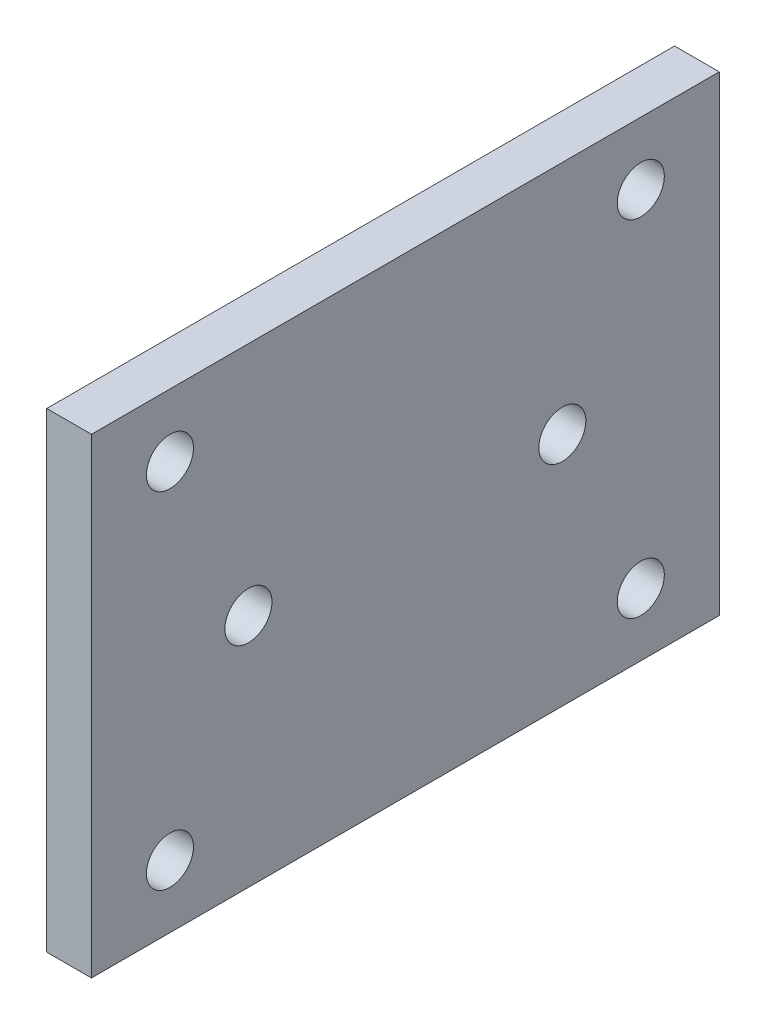
ISO-10303-21;
HEADER;
FILE_DESCRIPTION(('STEP AP214'),'2;1');
FILE_NAME('part.step','',(''),(''),'','','');
FILE_SCHEMA(('AUTOMOTIVE_DESIGN { 1 0 10303 214 1 1 1 1 }'));
ENDSEC;
DATA;
#1=APPLICATION_CONTEXT('core data for automotive mechanical design processes');
#2=APPLICATION_PROTOCOL_DEFINITION('international standard','automotive_design',2000,#1);
#3=PRODUCT_CONTEXT('',#1,'mechanical');
#4=PRODUCT('Part','Part','',(#3));
#5=PRODUCT_RELATED_PRODUCT_CATEGORY('part','',(#4));
#6=PRODUCT_DEFINITION_FORMATION('','',#4);
#7=PRODUCT_DEFINITION_CONTEXT('part definition',#1,'design');
#8=PRODUCT_DEFINITION('design','',#6,#7);
#9=PRODUCT_DEFINITION_SHAPE('','',#8);
#10=(LENGTH_UNIT() NAMED_UNIT(*) SI_UNIT(.MILLI.,.METRE.));
#11=(NAMED_UNIT(*) PLANE_ANGLE_UNIT() SI_UNIT($,.RADIAN.));
#12=(NAMED_UNIT(*) SI_UNIT($,.STERADIAN.) SOLID_ANGLE_UNIT());
#13=UNCERTAINTY_MEASURE_WITH_UNIT(LENGTH_MEASURE(1.E-05),#10,'distance_accuracy_value','');
#14=(GEOMETRIC_REPRESENTATION_CONTEXT(3) GLOBAL_UNCERTAINTY_ASSIGNED_CONTEXT((#13)) GLOBAL_UNIT_ASSIGNED_CONTEXT((#10,
#11,#12)) REPRESENTATION_CONTEXT('',''));
#15=CARTESIAN_POINT('',(0.,0.,0.));
#16=DIRECTION('',(0.,0.,1.));
#17=DIRECTION('',(1.,0.,0.));
#18=AXIS2_PLACEMENT_3D('',#15,#16,#17);
#19=CARTESIAN_POINT('',(2.85,0.,0.));
#20=DIRECTION('',(1.,0.,0.));
#21=DIRECTION('',(0.,0.,-1.));
#22=AXIS2_PLACEMENT_3D('',#19,#20,#21);
#23=PLANE('',#22);
#24=CARTESIAN_POINT('',(2.85,-11.,15.));
#25=DIRECTION('',(-1.,0.,0.));
#26=DIRECTION('',(0.,0.,-1.));
#27=AXIS2_PLACEMENT_3D('',#24,#25,#26);
#28=CIRCLE('',#27,1.5);
#29=CARTESIAN_POINT('',(2.85,-11.,13.5));
#30=VERTEX_POINT('',#29);
#31=EDGE_CURVE('E136',#30,#30,#28,.T.);
#32=ORIENTED_EDGE('',*,*,#31,.T.);
#33=EDGE_LOOP('',(#32));
#34=FACE_BOUND('',#33,.T.);
#35=CARTESIAN_POINT('',(2.85,11.,-15.));
#36=DIRECTION('',(1.,0.,0.));
#37=DIRECTION('',(0.,0.,-1.));
#38=AXIS2_PLACEMENT_3D('',#35,#36,#37);
#39=CIRCLE('',#38,1.5);
#40=CARTESIAN_POINT('',(2.85,11.,-16.5));
#41=VERTEX_POINT('',#40);
#42=EDGE_CURVE('E130',#41,#41,#39,.T.);
#43=ORIENTED_EDGE('',*,*,#42,.F.);
#44=EDGE_LOOP('',(#43));
#45=FACE_BOUND('',#44,.T.);
#46=CARTESIAN_POINT('',(2.85,11.,15.));
#47=DIRECTION('',(1.,0.,0.));
#48=DIRECTION('',(0.,0.,-1.));
#49=AXIS2_PLACEMENT_3D('',#46,#47,#48);
#50=CIRCLE('',#49,1.5);
#51=CARTESIAN_POINT('',(2.85,11.,13.5));
#52=VERTEX_POINT('',#51);
#53=EDGE_CURVE('E124',#52,#52,#50,.T.);
#54=ORIENTED_EDGE('',*,*,#53,.F.);
#55=EDGE_LOOP('',(#54));
#56=FACE_BOUND('',#55,.T.);
#57=CARTESIAN_POINT('',(2.85,0.,-10.));
#58=DIRECTION('',(1.,0.,0.));
#59=DIRECTION('',(0.,0.,-1.));
#60=AXIS2_PLACEMENT_3D('',#57,#58,#59);
#61=CIRCLE('',#60,1.5);
#62=CARTESIAN_POINT('',(2.85,0.,-11.5));
#63=VERTEX_POINT('',#62);
#64=EDGE_CURVE('E118',#63,#63,#61,.T.);
#65=ORIENTED_EDGE('',*,*,#64,.F.);
#66=EDGE_LOOP('',(#65));
#67=FACE_BOUND('',#66,.T.);
#68=CARTESIAN_POINT('',(2.85,0.,10.));
#69=DIRECTION('',(1.,0.,0.));
#70=DIRECTION('',(0.,0.,-1.));
#71=AXIS2_PLACEMENT_3D('',#68,#69,#70);
#72=CIRCLE('',#71,1.5);
#73=CARTESIAN_POINT('',(2.85,0.,8.5));
#74=VERTEX_POINT('',#73);
#75=EDGE_CURVE('E112',#74,#74,#72,.T.);
#76=ORIENTED_EDGE('',*,*,#75,.F.);
#77=EDGE_LOOP('',(#76));
#78=FACE_BOUND('',#77,.T.);
#79=DIRECTION('',(0.,1.,0.));
#80=VECTOR('',#79,1.);
#81=CARTESIAN_POINT('',(2.85,15.,-20.));
#82=LINE('',#81,#80);
#83=CARTESIAN_POINT('',(2.85,-15.,-20.));
#84=VERTEX_POINT('',#83);
#85=CARTESIAN_POINT('',(2.85,15.,-20.));
#86=VERTEX_POINT('',#85);
#87=EDGE_CURVE('E85',#84,#86,#82,.T.);
#88=ORIENTED_EDGE('',*,*,#87,.T.);
#89=DIRECTION('',(0.,0.,1.));
#90=VECTOR('',#89,1.);
#91=CARTESIAN_POINT('',(2.85,15.,20.));
#92=LINE('',#91,#90);
#93=CARTESIAN_POINT('',(2.85,15.,20.));
#94=VERTEX_POINT('',#93);
#95=EDGE_CURVE('E80',#86,#94,#92,.T.);
#96=ORIENTED_EDGE('',*,*,#95,.T.);
#97=DIRECTION('',(0.,-1.,0.));
#98=VECTOR('',#97,1.);
#99=CARTESIAN_POINT('',(2.85,15.,20.));
#100=LINE('',#99,#98);
#101=CARTESIAN_POINT('',(2.85,-15.,20.));
#102=VERTEX_POINT('',#101);
#103=EDGE_CURVE('E83',#94,#102,#100,.T.);
#104=ORIENTED_EDGE('',*,*,#103,.T.);
#105=DIRECTION('',(0.,0.,-1.));
#106=VECTOR('',#105,1.);
#107=CARTESIAN_POINT('',(2.85,-15.,20.));
#108=LINE('',#107,#106);
#109=EDGE_CURVE('E50',#102,#84,#108,.T.);
#110=ORIENTED_EDGE('',*,*,#109,.T.);
#111=EDGE_LOOP('',(#88,#96,#104,#110));
#112=FACE_BOUND('',#111,.T.);
#113=CARTESIAN_POINT('',(2.85,-11.,-15.));
#114=DIRECTION('',(-1.,0.,0.));
#115=DIRECTION('',(0.,0.,-1.));
#116=AXIS2_PLACEMENT_3D('',#113,#114,#115);
#117=CIRCLE('',#116,1.5);
#118=CARTESIAN_POINT('',(2.85,-11.,-16.5));
#119=VERTEX_POINT('',#118);
#120=EDGE_CURVE('E142',#119,#119,#117,.T.);
#121=ORIENTED_EDGE('',*,*,#120,.T.);
#122=EDGE_LOOP('',(#121));
#123=FACE_BOUND('',#122,.T.);
#124=ADVANCED_FACE('F33',(#34,#45,#56,#67,#78,#112,#123),#23,.T.);
#125=CARTESIAN_POINT('',(0.,0.,0.));
#126=DIRECTION('',(1.,0.,0.));
#127=DIRECTION('',(0.,0.,-1.));
#128=AXIS2_PLACEMENT_3D('',#125,#126,#127);
#129=PLANE('',#128);
#130=CARTESIAN_POINT('',(0.,-11.,15.));
#131=DIRECTION('',(-1.,0.,0.));
#132=DIRECTION('',(0.,0.,-1.));
#133=AXIS2_PLACEMENT_3D('',#130,#131,#132);
#134=CIRCLE('',#133,1.5);
#135=CARTESIAN_POINT('',(0.,-11.,13.5));
#136=VERTEX_POINT('',#135);
#137=EDGE_CURVE('E133',#136,#136,#134,.T.);
#138=ORIENTED_EDGE('',*,*,#137,.F.);
#139=EDGE_LOOP('',(#138));
#140=FACE_BOUND('',#139,.T.);
#141=CARTESIAN_POINT('',(0.,11.,-15.));
#142=DIRECTION('',(1.,0.,0.));
#143=DIRECTION('',(0.,0.,-1.));
#144=AXIS2_PLACEMENT_3D('',#141,#142,#143);
#145=CIRCLE('',#144,1.5);
#146=CARTESIAN_POINT('',(0.,11.,-16.5));
#147=VERTEX_POINT('',#146);
#148=EDGE_CURVE('E127',#147,#147,#145,.T.);
#149=ORIENTED_EDGE('',*,*,#148,.T.);
#150=EDGE_LOOP('',(#149));
#151=FACE_BOUND('',#150,.T.);
#152=CARTESIAN_POINT('',(0.,11.,15.));
#153=DIRECTION('',(1.,0.,0.));
#154=DIRECTION('',(0.,0.,-1.));
#155=AXIS2_PLACEMENT_3D('',#152,#153,#154);
#156=CIRCLE('',#155,1.5);
#157=CARTESIAN_POINT('',(0.,11.,13.5));
#158=VERTEX_POINT('',#157);
#159=EDGE_CURVE('E121',#158,#158,#156,.T.);
#160=ORIENTED_EDGE('',*,*,#159,.T.);
#161=EDGE_LOOP('',(#160));
#162=FACE_BOUND('',#161,.T.);
#163=CARTESIAN_POINT('',(0.,0.,-10.));
#164=DIRECTION('',(1.,0.,0.));
#165=DIRECTION('',(0.,0.,-1.));
#166=AXIS2_PLACEMENT_3D('',#163,#164,#165);
#167=CIRCLE('',#166,1.5);
#168=CARTESIAN_POINT('',(0.,0.,-11.5));
#169=VERTEX_POINT('',#168);
#170=EDGE_CURVE('E115',#169,#169,#167,.T.);
#171=ORIENTED_EDGE('',*,*,#170,.T.);
#172=EDGE_LOOP('',(#171));
#173=FACE_BOUND('',#172,.T.);
#174=CARTESIAN_POINT('',(0.,0.,10.));
#175=DIRECTION('',(1.,0.,0.));
#176=DIRECTION('',(0.,0.,-1.));
#177=AXIS2_PLACEMENT_3D('',#174,#175,#176);
#178=CIRCLE('',#177,1.5);
#179=CARTESIAN_POINT('',(0.,0.,8.5));
#180=VERTEX_POINT('',#179);
#181=EDGE_CURVE('E100',#180,#180,#178,.T.);
#182=ORIENTED_EDGE('',*,*,#181,.T.);
#183=EDGE_LOOP('',(#182));
#184=FACE_BOUND('',#183,.T.);
#185=DIRECTION('',(0.,1.,0.));
#186=VECTOR('',#185,1.);
#187=CARTESIAN_POINT('',(0.,15.,-20.));
#188=LINE('',#187,#186);
#189=CARTESIAN_POINT('',(0.,-15.,-20.));
#190=VERTEX_POINT('',#189);
#191=CARTESIAN_POINT('',(0.,15.,-20.));
#192=VERTEX_POINT('',#191);
#193=EDGE_CURVE('E97',#190,#192,#188,.T.);
#194=ORIENTED_EDGE('',*,*,#193,.F.);
#195=DIRECTION('',(0.,0.,-1.));
#196=VECTOR('',#195,1.);
#197=CARTESIAN_POINT('',(0.,-15.,20.));
#198=LINE('',#197,#196);
#199=CARTESIAN_POINT('',(0.,-15.,20.));
#200=VERTEX_POINT('',#199);
#201=EDGE_CURVE('E73',#200,#190,#198,.T.);
#202=ORIENTED_EDGE('',*,*,#201,.F.);
#203=DIRECTION('',(0.,-1.,0.));
#204=VECTOR('',#203,1.);
#205=CARTESIAN_POINT('',(0.,15.,20.));
#206=LINE('',#205,#204);
#207=CARTESIAN_POINT('',(0.,15.,20.));
#208=VERTEX_POINT('',#207);
#209=EDGE_CURVE('E67',#208,#200,#206,.T.);
#210=ORIENTED_EDGE('',*,*,#209,.F.);
#211=DIRECTION('',(0.,0.,1.));
#212=VECTOR('',#211,1.);
#213=CARTESIAN_POINT('',(0.,15.,20.));
#214=LINE('',#213,#212);
#215=EDGE_CURVE('E89',#192,#208,#214,.T.);
#216=ORIENTED_EDGE('',*,*,#215,.F.);
#217=EDGE_LOOP('',(#194,#202,#210,#216));
#218=FACE_BOUND('',#217,.T.);
#219=CARTESIAN_POINT('',(0.,-11.,-15.));
#220=DIRECTION('',(-1.,0.,0.));
#221=DIRECTION('',(0.,0.,-1.));
#222=AXIS2_PLACEMENT_3D('',#219,#220,#221);
#223=CIRCLE('',#222,1.5);
#224=CARTESIAN_POINT('',(0.,-11.,-16.5));
#225=VERTEX_POINT('',#224);
#226=EDGE_CURVE('E139',#225,#225,#223,.T.);
#227=ORIENTED_EDGE('',*,*,#226,.F.);
#228=EDGE_LOOP('',(#227));
#229=FACE_BOUND('',#228,.T.);
#230=ADVANCED_FACE('F108',(#140,#151,#162,#173,#184,#218,#229),#129,.F.);
#231=CARTESIAN_POINT('',(2.85,15.,-20.));
#232=DIRECTION('',(0.,0.,1.));
#233=DIRECTION('',(1.,0.,0.));
#234=AXIS2_PLACEMENT_3D('',#231,#232,#233);
#235=PLANE('',#234);
#236=ORIENTED_EDGE('',*,*,#193,.T.);
#237=DIRECTION('',(-1.,0.,0.));
#238=VECTOR('',#237,1.);
#239=CARTESIAN_POINT('',(2.85,15.,-20.));
#240=LINE('',#239,#238);
#241=EDGE_CURVE('E11',#86,#192,#240,.T.);
#242=ORIENTED_EDGE('',*,*,#241,.F.);
#243=ORIENTED_EDGE('',*,*,#87,.F.);
#244=DIRECTION('',(-1.,0.,0.));
#245=VECTOR('',#244,1.);
#246=CARTESIAN_POINT('',(2.85,-15.,-20.));
#247=LINE('',#246,#245);
#248=EDGE_CURVE('E93',#84,#190,#247,.T.);
#249=ORIENTED_EDGE('',*,*,#248,.T.);
#250=EDGE_LOOP('',(#236,#242,#243,#249));
#251=FACE_BOUND('',#250,.T.);
#252=ADVANCED_FACE('F35',(#251),#235,.F.);
#253=CARTESIAN_POINT('',(2.85,15.,20.));
#254=DIRECTION('',(0.,-1.,0.));
#255=DIRECTION('',(0.,0.,-1.));
#256=AXIS2_PLACEMENT_3D('',#253,#254,#255);
#257=PLANE('',#256);
#258=ORIENTED_EDGE('',*,*,#215,.T.);
#259=DIRECTION('',(-1.,0.,0.));
#260=VECTOR('',#259,1.);
#261=CARTESIAN_POINT('',(2.85,15.,20.));
#262=LINE('',#261,#260);
#263=EDGE_CURVE('E42',#94,#208,#262,.T.);
#264=ORIENTED_EDGE('',*,*,#263,.F.);
#265=ORIENTED_EDGE('',*,*,#95,.F.);
#266=ORIENTED_EDGE('',*,*,#241,.T.);
#267=EDGE_LOOP('',(#258,#264,#265,#266));
#268=FACE_BOUND('',#267,.T.);
#269=ADVANCED_FACE('F88',(#268),#257,.F.);
#270=CARTESIAN_POINT('',(2.85,15.,20.));
#271=DIRECTION('',(0.,0.,-1.));
#272=DIRECTION('',(-1.,0.,0.));
#273=AXIS2_PLACEMENT_3D('',#270,#271,#272);
#274=PLANE('',#273);
#275=ORIENTED_EDGE('',*,*,#209,.T.);
#276=DIRECTION('',(-1.,0.,0.));
#277=VECTOR('',#276,1.);
#278=CARTESIAN_POINT('',(2.85,-15.,20.));
#279=LINE('',#278,#277);
#280=EDGE_CURVE('E90',#102,#200,#279,.T.);
#281=ORIENTED_EDGE('',*,*,#280,.F.);
#282=ORIENTED_EDGE('',*,*,#103,.F.);
#283=ORIENTED_EDGE('',*,*,#263,.T.);
#284=EDGE_LOOP('',(#275,#281,#282,#283));
#285=FACE_BOUND('',#284,.T.);
#286=ADVANCED_FACE('F91',(#285),#274,.F.);
#287=CARTESIAN_POINT('',(2.85,-15.,20.));
#288=DIRECTION('',(0.,1.,0.));
#289=DIRECTION('',(0.,0.,1.));
#290=AXIS2_PLACEMENT_3D('',#287,#288,#289);
#291=PLANE('',#290);
#292=ORIENTED_EDGE('',*,*,#201,.T.);
#293=ORIENTED_EDGE('',*,*,#248,.F.);
#294=ORIENTED_EDGE('',*,*,#109,.F.);
#295=ORIENTED_EDGE('',*,*,#280,.T.);
#296=EDGE_LOOP('',(#292,#293,#294,#295));
#297=FACE_BOUND('',#296,.T.);
#298=ADVANCED_FACE('F105',(#297),#291,.F.);
#299=CARTESIAN_POINT('',(0.,0.,10.));
#300=DIRECTION('',(1.,0.,0.));
#301=DIRECTION('',(0.,0.,-1.));
#302=AXIS2_PLACEMENT_3D('',#299,#300,#301);
#303=CYLINDRICAL_SURFACE('',#302,1.5);
#304=ORIENTED_EDGE('',*,*,#181,.F.);
#305=EDGE_LOOP('',(#304));
#306=FACE_BOUND('',#305,.T.);
#307=ORIENTED_EDGE('',*,*,#75,.T.);
#308=EDGE_LOOP('',(#307));
#309=FACE_BOUND('',#308,.T.);
#310=ADVANCED_FACE('F166',(#306,#309),#303,.F.);
#311=CARTESIAN_POINT('',(0.,0.,-10.));
#312=DIRECTION('',(1.,0.,0.));
#313=DIRECTION('',(0.,0.,-1.));
#314=AXIS2_PLACEMENT_3D('',#311,#312,#313);
#315=CYLINDRICAL_SURFACE('',#314,1.5);
#316=ORIENTED_EDGE('',*,*,#170,.F.);
#317=EDGE_LOOP('',(#316));
#318=FACE_BOUND('',#317,.T.);
#319=ORIENTED_EDGE('',*,*,#64,.T.);
#320=EDGE_LOOP('',(#319));
#321=FACE_BOUND('',#320,.T.);
#322=ADVANCED_FACE('F200',(#318,#321),#315,.F.);
#323=CARTESIAN_POINT('',(0.,11.,15.));
#324=DIRECTION('',(1.,0.,0.));
#325=DIRECTION('',(0.,0.,-1.));
#326=AXIS2_PLACEMENT_3D('',#323,#324,#325);
#327=CYLINDRICAL_SURFACE('',#326,1.5);
#328=ORIENTED_EDGE('',*,*,#159,.F.);
#329=EDGE_LOOP('',(#328));
#330=FACE_BOUND('',#329,.T.);
#331=ORIENTED_EDGE('',*,*,#53,.T.);
#332=EDGE_LOOP('',(#331));
#333=FACE_BOUND('',#332,.T.);
#334=ADVANCED_FACE('F207',(#330,#333),#327,.F.);
#335=CARTESIAN_POINT('',(0.,11.,-15.));
#336=DIRECTION('',(1.,0.,0.));
#337=DIRECTION('',(0.,0.,-1.));
#338=AXIS2_PLACEMENT_3D('',#335,#336,#337);
#339=CYLINDRICAL_SURFACE('',#338,1.5);
#340=ORIENTED_EDGE('',*,*,#148,.F.);
#341=EDGE_LOOP('',(#340));
#342=FACE_BOUND('',#341,.T.);
#343=ORIENTED_EDGE('',*,*,#42,.T.);
#344=EDGE_LOOP('',(#343));
#345=FACE_BOUND('',#344,.T.);
#346=ADVANCED_FACE('F215',(#342,#345),#339,.F.);
#347=CARTESIAN_POINT('',(0.,-11.,15.));
#348=DIRECTION('',(1.,0.,0.));
#349=DIRECTION('',(0.,0.,-1.));
#350=AXIS2_PLACEMENT_3D('',#347,#348,#349);
#351=CYLINDRICAL_SURFACE('',#350,1.5);
#352=ORIENTED_EDGE('',*,*,#137,.T.);
#353=EDGE_LOOP('',(#352));
#354=FACE_BOUND('',#353,.T.);
#355=ORIENTED_EDGE('',*,*,#31,.F.);
#356=EDGE_LOOP('',(#355));
#357=FACE_BOUND('',#356,.T.);
#358=ADVANCED_FACE('F222',(#354,#357),#351,.F.);
#359=CARTESIAN_POINT('',(0.,-11.,-15.));
#360=DIRECTION('',(1.,0.,0.));
#361=DIRECTION('',(0.,0.,-1.));
#362=AXIS2_PLACEMENT_3D('',#359,#360,#361);
#363=CYLINDRICAL_SURFACE('',#362,1.5);
#364=ORIENTED_EDGE('',*,*,#226,.T.);
#365=EDGE_LOOP('',(#364));
#366=FACE_BOUND('',#365,.T.);
#367=ORIENTED_EDGE('',*,*,#120,.F.);
#368=EDGE_LOOP('',(#367));
#369=FACE_BOUND('',#368,.T.);
#370=ADVANCED_FACE('F148',(#366,#369),#363,.F.);
#371=CLOSED_SHELL('',(#124,#230,#252,#269,#286,#298,#310,#322,#334,#346,#358,#370));
#372=MANIFOLD_SOLID_BREP('B2',#371);
#373=ADVANCED_BREP_SHAPE_REPRESENTATION('',(#18,#372),#14);
#374=SHAPE_DEFINITION_REPRESENTATION(#9,#373);
ENDSEC;
END-ISO-10303-21;
